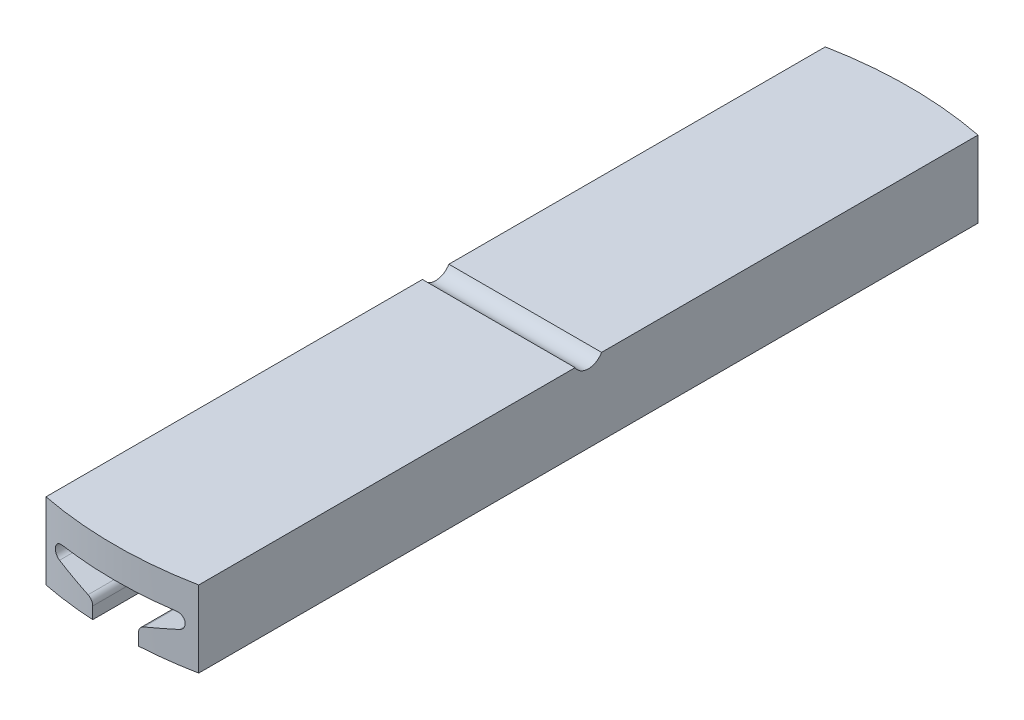
ISO-10303-21;
HEADER;
FILE_DESCRIPTION(('STEP AP214'),'2;1');
FILE_NAME('part.step','',(''),(''),'','','');
FILE_SCHEMA(('AUTOMOTIVE_DESIGN { 1 0 10303 214 1 1 1 1 }'));
ENDSEC;
DATA;
#1=APPLICATION_CONTEXT('core data for automotive mechanical design processes');
#2=APPLICATION_PROTOCOL_DEFINITION('international standard','automotive_design',2000,#1);
#3=PRODUCT_CONTEXT('',#1,'mechanical');
#4=PRODUCT('Part','Part','',(#3));
#5=PRODUCT_RELATED_PRODUCT_CATEGORY('part','',(#4));
#6=PRODUCT_DEFINITION_FORMATION('','',#4);
#7=PRODUCT_DEFINITION_CONTEXT('part definition',#1,'design');
#8=PRODUCT_DEFINITION('design','',#6,#7);
#9=PRODUCT_DEFINITION_SHAPE('','',#8);
#10=(LENGTH_UNIT() NAMED_UNIT(*) SI_UNIT(.MILLI.,.METRE.));
#11=(NAMED_UNIT(*) PLANE_ANGLE_UNIT() SI_UNIT($,.RADIAN.));
#12=(NAMED_UNIT(*) SI_UNIT($,.STERADIAN.) SOLID_ANGLE_UNIT());
#13=UNCERTAINTY_MEASURE_WITH_UNIT(LENGTH_MEASURE(1.E-05),#10,'distance_accuracy_value','');
#14=(GEOMETRIC_REPRESENTATION_CONTEXT(3) GLOBAL_UNCERTAINTY_ASSIGNED_CONTEXT((#13)) GLOBAL_UNIT_ASSIGNED_CONTEXT((#10,
#11,#12)) REPRESENTATION_CONTEXT('',''));
#15=CARTESIAN_POINT('',(0.,0.,0.));
#16=DIRECTION('',(0.,0.,1.));
#17=DIRECTION('',(1.,0.,0.));
#18=AXIS2_PLACEMENT_3D('',#15,#16,#17);
#19=CARTESIAN_POINT('',(57.,-21.,0.));
#20=DIRECTION('',(0.,-1.,0.));
#21=DIRECTION('',(0.,0.,-1.));
#22=AXIS2_PLACEMENT_3D('',#19,#20,#21);
#23=PLANE('',#22);
#24=DIRECTION('',(0.,0.,1.));
#25=VECTOR('',#24,1.);
#26=CARTESIAN_POINT('',(3.,-21.,0.));
#27=LINE('',#26,#25);
#28=CARTESIAN_POINT('',(3.,-21.,-51.9133894096696));
#29=VERTEX_POINT('',#28);
#30=CARTESIAN_POINT('',(3.,-21.,51.9133894096696));
#31=VERTEX_POINT('',#30);
#32=EDGE_CURVE('E175',#29,#31,#27,.T.);
#33=ORIENTED_EDGE('',*,*,#32,.F.);
#34=CARTESIAN_POINT('',(0.,-21.,0.));
#35=DIRECTION('',(0.,-1.,0.));
#36=DIRECTION('',(0.,0.,-1.));
#37=AXIS2_PLACEMENT_3D('',#34,#35,#36);
#38=CIRCLE('',#37,52.);
#39=CARTESIAN_POINT('',(9.99999999999997,-21.,-51.0294032886923));
#40=VERTEX_POINT('',#39);
#41=EDGE_CURVE('E61',#29,#40,#38,.T.);
#42=ORIENTED_EDGE('',*,*,#41,.T.);
#43=DIRECTION('',(0.,0.,1.));
#44=VECTOR('',#43,1.);
#45=CARTESIAN_POINT('',(9.99999999999999,-21.,-85.002));
#46=LINE('',#45,#44);
#47=CARTESIAN_POINT('',(9.99999999999997,-21.,51.0294032886923));
#48=VERTEX_POINT('',#47);
#49=EDGE_CURVE('E167',#40,#48,#46,.T.);
#50=ORIENTED_EDGE('',*,*,#49,.T.);
#51=EDGE_CURVE('E169',#48,#31,#38,.T.);
#52=ORIENTED_EDGE('',*,*,#51,.T.);
#53=EDGE_LOOP('',(#33,#42,#50,#52));
#54=FACE_BOUND('',#53,.T.);
#55=ADVANCED_FACE('F57',(#54),#23,.T.);
#56=DIRECTION('',(0.,0.,-1.));
#57=VECTOR('',#56,1.);
#58=CARTESIAN_POINT('',(-3.,-21.,0.));
#59=LINE('',#58,#57);
#60=CARTESIAN_POINT('',(-2.99999999999996,-21.,51.9133894096696));
#61=VERTEX_POINT('',#60);
#62=CARTESIAN_POINT('',(-2.99999999999996,-21.,-51.9133894096696));
#63=VERTEX_POINT('',#62);
#64=EDGE_CURVE('E188',#61,#63,#59,.T.);
#65=ORIENTED_EDGE('',*,*,#64,.F.);
#66=CARTESIAN_POINT('',(-10.,-21.,51.0294032886923));
#67=VERTEX_POINT('',#66);
#68=EDGE_CURVE('E392',#61,#67,#38,.T.);
#69=ORIENTED_EDGE('',*,*,#68,.T.);
#70=DIRECTION('',(0.,0.,1.));
#71=VECTOR('',#70,1.);
#72=CARTESIAN_POINT('',(-10.,-21.,-85.002));
#73=LINE('',#72,#71);
#74=CARTESIAN_POINT('',(-10.,-21.,-51.0294032886923));
#75=VERTEX_POINT('',#74);
#76=EDGE_CURVE('E209',#75,#67,#73,.T.);
#77=ORIENTED_EDGE('',*,*,#76,.F.);
#78=EDGE_CURVE('E168',#75,#63,#38,.T.);
#79=ORIENTED_EDGE('',*,*,#78,.T.);
#80=EDGE_LOOP('',(#65,#69,#77,#79));
#81=FACE_BOUND('',#80,.T.);
#82=ADVANCED_FACE('F332',(#81),#23,.T.);
#83=CARTESIAN_POINT('',(-7.5,-16.,-85.));
#84=DIRECTION('',(0.,0.,1.));
#85=DIRECTION('',(1.,0.,0.));
#86=AXIS2_PLACEMENT_3D('',#83,#84,#85);
#87=CYLINDRICAL_SURFACE('',#86,0.999999999999999);
#88=CARTESIAN_POINT('',(-7.85070721723684,-16.9364851561974,51.4039531183082));
#89=CARTESIAN_POINT('',(-7.90353260362164,-16.916751266977,51.3958875017139));
#90=CARTESIAN_POINT('',(-7.95467117386094,-16.8924605245184,51.3879917953355));
#91=CARTESIAN_POINT('',(-8.05220284467704,-16.8356033406847,51.3727983159302));
#92=CARTESIAN_POINT('',(-8.09859702432048,-16.803038787007,51.3655004070154));
#93=CARTESIAN_POINT('',(-8.18532370513233,-16.7304368635109,51.3517519204609));
#94=CARTESIAN_POINT('',(-8.225651945816,-16.6903942852527,51.34530193877));
#95=CARTESIAN_POINT('',(-8.2990068993382,-16.6039841013502,51.3334965061412));
#96=CARTESIAN_POINT('',(-8.33203621661436,-16.5576187614056,51.3281406648386));
#97=CARTESIAN_POINT('',(-8.3895642115429,-16.4602673719661,51.3187690748143));
#98=CARTESIAN_POINT('',(-8.41413145283524,-16.4093228919166,51.3147425668459));
#99=CARTESIAN_POINT('',(-8.4543612678185,-16.3039336907956,51.308129899944));
#100=CARTESIAN_POINT('',(-8.47002288657924,-16.2494885950572,51.3055438954731));
#101=CARTESIAN_POINT('',(-8.49181346980441,-16.139353998478,51.3019417349885));
#102=CARTESIAN_POINT('',(-8.49805457883655,-16.0836872728179,51.3009071118624));
#103=CARTESIAN_POINT('',(-8.50116748868832,-15.9720901851432,51.3003913648465));
#104=CARTESIAN_POINT('',(-8.49804032509515,-15.9161598529505,51.3009100692489));
#105=CARTESIAN_POINT('',(-8.48256167299117,-15.80596278466,51.3034716880674));
#106=CARTESIAN_POINT('',(-8.47026425508352,-15.7516882304609,51.3055056678917));
#107=CARTESIAN_POINT('',(-8.43688212541409,-15.6459890293354,51.311005680294));
#108=CARTESIAN_POINT('',(-8.41579710245438,-15.5945644834103,51.3144717635875));
#109=CARTESIAN_POINT('',(-8.365377022303,-15.4958098906054,51.3227154298492));
#110=CARTESIAN_POINT('',(-8.33601193288584,-15.4484955844895,51.3274977854678));
#111=CARTESIAN_POINT('',(-8.26992851690416,-15.3594661310073,51.3381865583419));
#112=CARTESIAN_POINT('',(-8.23321030044558,-15.317750899816,51.3440929587658));
#113=CARTESIAN_POINT('',(-8.15303903520241,-15.2406135227867,51.3568848010627));
#114=CARTESIAN_POINT('',(-8.10951771158813,-15.2052639918314,51.363780102074));
#115=CARTESIAN_POINT('',(-8.01725025426417,-15.1423456332039,51.3782626797031));
#116=CARTESIAN_POINT('',(-7.96850189759336,-15.1147801341903,51.3858502505244));
#117=CARTESIAN_POINT('',(-7.86652075834944,-15.0678762767657,51.4015617117618));
#118=CARTESIAN_POINT('',(-7.81323894818296,-15.0486466786535,51.409691183075));
#119=CARTESIAN_POINT('',(-7.70427285017815,-15.0194678266944,51.4261334483683));
#120=CARTESIAN_POINT('',(-7.64859262769653,-15.0095034692364,51.4344459213017));
#121=CARTESIAN_POINT('',(-7.57715123918404,-15.002860002719,51.4449902798717));
#122=CARTESIAN_POINT('',(-7.56172880255109,-15.0017869789128,51.4472594267135));
#123=CARTESIAN_POINT('',(-7.53087316433267,-15.0003579515914,51.451785106627));
#124=CARTESIAN_POINT('',(-7.51544001579728,-15.0000008476817,51.4540416537324));
#125=CARTESIAN_POINT('',(-7.5,-15.,51.4562921322553));
#126=B_SPLINE_CURVE_WITH_KNOTS('',3,(#88,#89,#90,#91,#92,#93,#94,#95,#96,#97,#98,#99,#100,#101,
#102,#103,#104,#105,#106,#107,#108,#109,#110,#111,#112,#113,#114,#115,#116,#117,#118,#119,#120,
#121,#122,#123,#124,#125),.UNSPECIFIED.,.F.,.F.,(4,2,2,2,2,2,2,2,2,2,2,2,2,2,2,2,2,2,4),(0.,
0.170684063890893,0.341329220564664,0.512093677790838,0.682797103262345,0.852082947782231,
1.02138694102677,1.18865913863527,1.35591284632993,1.52218809666285,1.68846923584859,
1.85536141952369,2.02225110433749,2.19093818369923,2.35969728927072,2.53059641360725,
2.70121645803805,2.74808211642799,2.79487568523367),.UNSPECIFIED.);
#127=CARTESIAN_POINT('',(-7.85070721723684,-16.9364851561974,51.4039531183081));
#128=VERTEX_POINT('',#127);
#129=CARTESIAN_POINT('',(-7.5,-15.,51.4562921322553));
#130=VERTEX_POINT('',#129);
#131=EDGE_CURVE('E357',#128,#130,#126,.T.);
#132=ORIENTED_EDGE('',*,*,#131,.F.);
#133=DIRECTION('',(0.,0.,1.));
#134=VECTOR('',#133,1.);
#135=CARTESIAN_POINT('',(-7.85070721723684,-16.9364851561974,-85.));
#136=LINE('',#135,#134);
#137=CARTESIAN_POINT('',(-7.85070721723684,-16.9364851561974,-51.4039531183082));
#138=VERTEX_POINT('',#137);
#139=EDGE_CURVE('E219',#138,#128,#136,.T.);
#140=ORIENTED_EDGE('',*,*,#139,.F.);
#141=CARTESIAN_POINT('',(-7.5,-15.,-51.4562921322553));
#142=CARTESIAN_POINT('',(-7.55679029365665,-14.999954862955,-51.4480183732125));
#143=CARTESIAN_POINT('',(-7.61355284678736,-15.004835000321,-51.4396453549943));
#144=CARTESIAN_POINT('',(-7.72542422522497,-15.024100675864,-51.4229609822562));
#145=CARTESIAN_POINT('',(-7.78053382155462,-15.0384817079258,-51.414649600392));
#146=CARTESIAN_POINT('',(-7.88758493232104,-15.0764142264997,-51.3983362270098));
#147=CARTESIAN_POINT('',(-7.93952482919636,-15.0999703507213,-51.390334394211));
#148=CARTESIAN_POINT('',(-8.03870813014423,-15.1555926976002,-51.3749129976661));
#149=CARTESIAN_POINT('',(-8.08595270197877,-15.1876567969442,-51.3674932892385));
#150=CARTESIAN_POINT('',(-8.17421942040034,-15.2592925722302,-51.3535211261875));
#151=CARTESIAN_POINT('',(-8.21526352122179,-15.298836587161,-51.3469656226725));
#152=CARTESIAN_POINT('',(-8.2901190428671,-15.3844161570371,-51.3349332028472));
#153=CARTESIAN_POINT('',(-8.32392976069881,-15.4304523422175,-51.329456391376));
#154=CARTESIAN_POINT('',(-8.38294934903987,-15.5271638037014,-51.3198504277134));
#155=CARTESIAN_POINT('',(-8.40824940783459,-15.5777820050976,-51.3157070110413));
#156=CARTESIAN_POINT('',(-8.44998129012798,-15.6826379293608,-51.3088517346127));
#157=CARTESIAN_POINT('',(-8.4664143054294,-15.7368751646985,-51.3061396824702));
#158=CARTESIAN_POINT('',(-8.48975928264279,-15.846729169997,-51.3022818882707));
#159=CARTESIAN_POINT('',(-8.49678367776645,-15.9023214144928,-51.3011176510659));
#160=CARTESIAN_POINT('',(-8.50146125084822,-16.0139098247509,-51.3003427155003));
#161=CARTESIAN_POINT('',(-8.49911462314496,-16.0699059821127,-51.3007319849226));
#162=CARTESIAN_POINT('',(-8.48516719900874,-16.1803454249546,-51.3030407088902));
#163=CARTESIAN_POINT('',(-8.47362394619863,-16.2347961929182,-51.3049506484975));
#164=CARTESIAN_POINT('',(-8.44170823452658,-16.3409664643344,-51.3102116679159));
#165=CARTESIAN_POINT('',(-8.42133633292048,-16.3926861399398,-51.3135626567694));
#166=CARTESIAN_POINT('',(-8.37229729936668,-16.4921180331151,-51.3215866314408));
#167=CARTESIAN_POINT('',(-8.34360453553917,-16.5398172709535,-51.3262637011568));
#168=CARTESIAN_POINT('',(-8.27877850556472,-16.6297438724848,-51.3367597397656));
#169=CARTESIAN_POINT('',(-8.2426421300115,-16.6719689374121,-51.3425791858132));
#170=CARTESIAN_POINT('',(-8.16352782025112,-16.7502429004688,-51.3552181993568));
#171=CARTESIAN_POINT('',(-8.12047663197522,-16.7862159542289,-51.3620484056836));
#172=CARTESIAN_POINT('',(-8.0291124597831,-16.8503795811979,-51.376409691725));
#173=CARTESIAN_POINT('',(-7.98080813348411,-16.8785826967466,-51.3839396153521));
#174=CARTESIAN_POINT('',(-7.90443643210849,-16.9150285675381,-51.3957255244387));
#175=CARTESIAN_POINT('',(-7.87778326329985,-16.926354671879,-51.3998183137172));
#176=CARTESIAN_POINT('',(-7.85070721723684,-16.9364851561974,-51.4039531183082));
#177=B_SPLINE_CURVE_WITH_KNOTS('',3,(#141,#142,#143,#144,#145,#146,#147,#148,#149,#150,#151,
#152,#153,#154,#155,#156,#157,#158,#159,#160,#161,#162,#163,#164,#165,#166,#167,#168,#169,#170,
#171,#172,#173,#174,#175,#176),.UNSPECIFIED.,.F.,.F.,(4,2,2,2,2,2,2,2,2,2,2,2,2,2,2,2,2,4),(0.,
0.171944147377924,0.343806803016595,0.515756442588236,0.687663209429171,0.858946265574074,
1.03024596068288,1.19964698682795,1.36902523842252,1.53636079972421,1.703692890797,
1.86998612465634,2.03626886377457,2.2030693682322,2.36993969177654,2.53871113311392,
2.70720852340783,2.79483602510992),.UNSPECIFIED.);
#178=CARTESIAN_POINT('',(-7.5,-15.,-51.4562921322553));
#179=VERTEX_POINT('',#178);
#180=EDGE_CURVE('E363',#179,#138,#177,.T.);
#181=ORIENTED_EDGE('',*,*,#180,.F.);
#182=DIRECTION('',(0.,0.,1.));
#183=VECTOR('',#182,1.);
#184=CARTESIAN_POINT('',(-7.5,-15.,-85.));
#185=LINE('',#184,#183);
#186=EDGE_CURVE('E251',#179,#130,#185,.T.);
#187=ORIENTED_EDGE('',*,*,#186,.T.);
#188=EDGE_LOOP('',(#132,#140,#181,#187));
#189=FACE_BOUND('',#188,.T.);
#190=ADVANCED_FACE('F315',(#189),#87,.F.);
#191=CARTESIAN_POINT('',(-7.5,-15.,-85.));
#192=DIRECTION('',(0.,1.,0.));
#193=DIRECTION('',(0.,0.,1.));
#194=AXIS2_PLACEMENT_3D('',#191,#192,#193);
#195=PLANE('',#194);
#196=CARTESIAN_POINT('',(0.,-15.,0.));
#197=DIRECTION('',(0.,1.,0.));
#198=DIRECTION('',(0.,0.,1.));
#199=AXIS2_PLACEMENT_3D('',#196,#197,#198);
#200=CIRCLE('',#199,52.);
#201=CARTESIAN_POINT('',(7.5,-15.,-51.4562921322553));
#202=VERTEX_POINT('',#201);
#203=EDGE_CURVE('E304',#202,#179,#200,.T.);
#204=ORIENTED_EDGE('',*,*,#203,.F.);
#205=DIRECTION('',(0.,0.,1.));
#206=VECTOR('',#205,1.);
#207=CARTESIAN_POINT('',(7.5,-15.,-85.));
#208=LINE('',#207,#206);
#209=CARTESIAN_POINT('',(7.5,-15.,51.4562921322553));
#210=VERTEX_POINT('',#209);
#211=EDGE_CURVE('E247',#202,#210,#208,.T.);
#212=ORIENTED_EDGE('',*,*,#211,.T.);
#213=EDGE_CURVE('E451',#130,#210,#200,.T.);
#214=ORIENTED_EDGE('',*,*,#213,.F.);
#215=ORIENTED_EDGE('',*,*,#186,.F.);
#216=EDGE_LOOP('',(#204,#212,#214,#215));
#217=FACE_BOUND('',#216,.T.);
#218=ADVANCED_FACE('F310',(#217),#195,.F.);
#219=CARTESIAN_POINT('',(7.5,-16.,-85.));
#220=DIRECTION('',(0.,0.,1.));
#221=DIRECTION('',(1.,0.,0.));
#222=AXIS2_PLACEMENT_3D('',#219,#220,#221);
#223=CYLINDRICAL_SURFACE('',#222,1.);
#224=CARTESIAN_POINT('',(7.5,-15.,51.4562921322553));
#225=CARTESIAN_POINT('',(7.55679029365665,-14.999954862955,51.4480183732125));
#226=CARTESIAN_POINT('',(7.61355284678736,-15.004835000321,51.4396453549943));
#227=CARTESIAN_POINT('',(7.72542422522497,-15.024100675864,51.4229609822562));
#228=CARTESIAN_POINT('',(7.78053382155462,-15.0384817079258,51.414649600392));
#229=CARTESIAN_POINT('',(7.88758493232104,-15.0764142264997,51.3983362270098));
#230=CARTESIAN_POINT('',(7.93952482919637,-15.0999703507213,51.390334394211));
#231=CARTESIAN_POINT('',(8.03870813014423,-15.1555926976002,51.3749129976661));
#232=CARTESIAN_POINT('',(8.08595270197878,-15.1876567969442,51.3674932892385));
#233=CARTESIAN_POINT('',(8.17421942040034,-15.2592925722302,51.3535211261875));
#234=CARTESIAN_POINT('',(8.21526352122179,-15.298836587161,51.3469656226725));
#235=CARTESIAN_POINT('',(8.2901190428671,-15.3844161570371,51.3349332028472));
#236=CARTESIAN_POINT('',(8.32392976069881,-15.4304523422175,51.329456391376));
#237=CARTESIAN_POINT('',(8.38294934903987,-15.5271638037014,51.3198504277134));
#238=CARTESIAN_POINT('',(8.40824940783459,-15.5777820050976,51.3157070110413));
#239=CARTESIAN_POINT('',(8.44998129012799,-15.6826379293608,51.3088517346127));
#240=CARTESIAN_POINT('',(8.4664143054294,-15.7368751646985,51.3061396824702));
#241=CARTESIAN_POINT('',(8.48975928264279,-15.846729169997,51.3022818882707));
#242=CARTESIAN_POINT('',(8.49678367776645,-15.9023214144928,51.3011176510659));
#243=CARTESIAN_POINT('',(8.50146125084822,-16.0139098247509,51.3003427155003));
#244=CARTESIAN_POINT('',(8.49911462314496,-16.0699059821127,51.3007319849226));
#245=CARTESIAN_POINT('',(8.48516719900874,-16.1803454249546,51.3030407088902));
#246=CARTESIAN_POINT('',(8.47362394619863,-16.2347961929182,51.3049506484975));
#247=CARTESIAN_POINT('',(8.44170823452658,-16.3409664643344,51.3102116679159));
#248=CARTESIAN_POINT('',(8.42133633292048,-16.3926861399398,51.3135626567694));
#249=CARTESIAN_POINT('',(8.37229729936668,-16.4921180331151,51.3215866314408));
#250=CARTESIAN_POINT('',(8.34360453553917,-16.5398172709535,51.3262637011568));
#251=CARTESIAN_POINT('',(8.27877850556472,-16.6297438724848,51.3367597397656));
#252=CARTESIAN_POINT('',(8.2426421300115,-16.6719689374121,51.3425791858132));
#253=CARTESIAN_POINT('',(8.16352782025111,-16.7502429004688,51.3552181993568));
#254=CARTESIAN_POINT('',(8.12047663197522,-16.7862159542289,51.3620484056836));
#255=CARTESIAN_POINT('',(8.0291124597831,-16.8503795811979,51.376409691725));
#256=CARTESIAN_POINT('',(7.98080813348411,-16.8785826967466,51.3839396153521));
#257=CARTESIAN_POINT('',(7.90443643210849,-16.9150285675381,51.3957255244387));
#258=CARTESIAN_POINT('',(7.87778326329985,-16.926354671879,51.3998183137172));
#259=CARTESIAN_POINT('',(7.85070721723684,-16.9364851561974,51.4039531183082));
#260=B_SPLINE_CURVE_WITH_KNOTS('',3,(#224,#225,#226,#227,#228,#229,#230,#231,#232,#233,#234,
#235,#236,#237,#238,#239,#240,#241,#242,#243,#244,#245,#246,#247,#248,#249,#250,#251,#252,#253,
#254,#255,#256,#257,#258,#259),.UNSPECIFIED.,.F.,.F.,(4,2,2,2,2,2,2,2,2,2,2,2,2,2,2,2,2,4),(0.,
0.171944147377927,0.343806803016597,0.51575644258824,0.687663209429174,0.858946265574076,
1.03024596068288,1.19964698682795,1.36902523842252,1.53636079972421,1.703692890797,
1.86998612465634,2.03626886377458,2.2030693682322,2.36993969177654,2.53871113311392,
2.70720852340783,2.79483602510992),.UNSPECIFIED.);
#261=CARTESIAN_POINT('',(7.85070721723684,-16.9364851561974,51.4039531183082));
#262=VERTEX_POINT('',#261);
#263=EDGE_CURVE('E273',#210,#262,#260,.T.);
#264=ORIENTED_EDGE('',*,*,#263,.F.);
#265=ORIENTED_EDGE('',*,*,#211,.F.);
#266=CARTESIAN_POINT('',(7.85070721723684,-16.9364851561974,-51.4039531183082));
#267=CARTESIAN_POINT('',(7.90353260362164,-16.916751266977,-51.3958875017139));
#268=CARTESIAN_POINT('',(7.95467117386094,-16.8924605245184,-51.3879917953355));
#269=CARTESIAN_POINT('',(8.05220284467705,-16.8356033406847,-51.3727983159302));
#270=CARTESIAN_POINT('',(8.09859702432048,-16.803038787007,-51.3655004070154));
#271=CARTESIAN_POINT('',(8.18532370513233,-16.7304368635109,-51.3517519204609));
#272=CARTESIAN_POINT('',(8.22565194581601,-16.6903942852527,-51.34530193877));
#273=CARTESIAN_POINT('',(8.2990068993382,-16.6039841013502,-51.3334965061412));
#274=CARTESIAN_POINT('',(8.33203621661436,-16.5576187614056,-51.3281406648386));
#275=CARTESIAN_POINT('',(8.3895642115429,-16.4602673719661,-51.3187690748143));
#276=CARTESIAN_POINT('',(8.41413145283525,-16.4093228919166,-51.3147425668459));
#277=CARTESIAN_POINT('',(8.4543612678185,-16.3039336907956,-51.308129899944));
#278=CARTESIAN_POINT('',(8.47002288657924,-16.2494885950572,-51.3055438954731));
#279=CARTESIAN_POINT('',(8.49181346980441,-16.139353998478,-51.3019417349885));
#280=CARTESIAN_POINT('',(8.49805457883655,-16.0836872728179,-51.3009071118624));
#281=CARTESIAN_POINT('',(8.50116748868832,-15.9720901851432,-51.3003913648465));
#282=CARTESIAN_POINT('',(8.49804032509515,-15.9161598529505,-51.3009100692489));
#283=CARTESIAN_POINT('',(8.48256167299117,-15.80596278466,-51.3034716880674));
#284=CARTESIAN_POINT('',(8.47026425508352,-15.7516882304609,-51.3055056678917));
#285=CARTESIAN_POINT('',(8.43688212541409,-15.6459890293354,-51.311005680294));
#286=CARTESIAN_POINT('',(8.41579710245438,-15.5945644834103,-51.3144717635875));
#287=CARTESIAN_POINT('',(8.365377022303,-15.4958098906054,-51.3227154298492));
#288=CARTESIAN_POINT('',(8.33601193288584,-15.4484955844895,-51.3274977854678));
#289=CARTESIAN_POINT('',(8.26992851690416,-15.3594661310073,-51.3381865583419));
#290=CARTESIAN_POINT('',(8.23321030044557,-15.317750899816,-51.3440929587658));
#291=CARTESIAN_POINT('',(8.1530390352024,-15.2406135227867,-51.3568848010627));
#292=CARTESIAN_POINT('',(8.10951771158812,-15.2052639918314,-51.363780102074));
#293=CARTESIAN_POINT('',(8.01725025426416,-15.1423456332039,-51.3782626797031));
#294=CARTESIAN_POINT('',(7.96850189759336,-15.1147801341903,-51.3858502505244));
#295=CARTESIAN_POINT('',(7.86652075834944,-15.0678762767656,-51.4015617117618));
#296=CARTESIAN_POINT('',(7.81323894818296,-15.0486466786535,-51.409691183075));
#297=CARTESIAN_POINT('',(7.70427285017815,-15.0194678266944,-51.4261334483683));
#298=CARTESIAN_POINT('',(7.64859262769653,-15.0095034692363,-51.4344459213017));
#299=CARTESIAN_POINT('',(7.57715123918404,-15.002860002719,-51.4449902798717));
#300=CARTESIAN_POINT('',(7.56172880255108,-15.0017869789128,-51.4472594267135));
#301=CARTESIAN_POINT('',(7.53087316433267,-15.0003579515914,-51.451785106627));
#302=CARTESIAN_POINT('',(7.51544001579728,-15.0000008476817,-51.4540416537324));
#303=CARTESIAN_POINT('',(7.5,-15.,-51.4562921322553));
#304=B_SPLINE_CURVE_WITH_KNOTS('',3,(#266,#267,#268,#269,#270,#271,#272,#273,#274,#275,#276,
#277,#278,#279,#280,#281,#282,#283,#284,#285,#286,#287,#288,#289,#290,#291,#292,#293,#294,#295,
#296,#297,#298,#299,#300,#301,#302,#303),.UNSPECIFIED.,.F.,.F.,(4,2,2,2,2,2,2,2,2,2,2,2,2,2,2,2,
2,2,4),(0.,0.170684063890893,0.341329220564666,0.512093677790847,0.68279710326235,
0.852082947782234,1.02138694102678,1.18865913863527,1.35591284632993,1.52218809666285,
1.6884692358486,1.8553614195237,2.02225110433749,2.19093818369924,2.35969728927072,
2.53059641360725,2.70121645803805,2.74808211642799,2.79487568523367),.UNSPECIFIED.);
#305=CARTESIAN_POINT('',(7.85070721723684,-16.9364851561974,-51.4039531183082));
#306=VERTEX_POINT('',#305);
#307=EDGE_CURVE('E298',#306,#202,#304,.T.);
#308=ORIENTED_EDGE('',*,*,#307,.F.);
#309=DIRECTION('',(0.,0.,1.));
#310=VECTOR('',#309,1.);
#311=CARTESIAN_POINT('',(7.85070721723684,-16.9364851561974,-85.));
#312=LINE('',#311,#310);
#313=EDGE_CURVE('E243',#306,#262,#312,.T.);
#314=ORIENTED_EDGE('',*,*,#313,.T.);
#315=EDGE_LOOP('',(#264,#265,#308,#314));
#316=FACE_BOUND('',#315,.T.);
#317=ADVANCED_FACE('F306',(#316),#223,.F.);
#318=CARTESIAN_POINT('',(3.64929278276316,-18.5098858182602,-85.));
#319=DIRECTION('',(0.350707217236838,-0.93648515619736,0.));
#320=DIRECTION('',(0.93648515619736,0.350707217236838,0.));
#321=AXIS2_PLACEMENT_3D('',#318,#319,#320);
#322=PLANE('',#321);
#323=CARTESIAN_POINT('',(0.,-19.8765207384784,0.));
#324=DIRECTION('',(0.350707217236838,-0.93648515619736,0.));
#325=DIRECTION('',(-0.93648515619736,-0.350707217236838,0.));
#326=AXIS2_PLACEMENT_3D('',#323,#324,#325);
#327=ELLIPSE('',#326,55.5267744030758,52.);
#328=CARTESIAN_POINT('',(3.64929278276316,-18.5098858182602,-51.8717906205837));
#329=VERTEX_POINT('',#328);
#330=EDGE_CURVE('E295',#329,#306,#327,.T.);
#331=ORIENTED_EDGE('',*,*,#330,.F.);
#332=DIRECTION('',(0.,0.,1.));
#333=VECTOR('',#332,1.);
#334=CARTESIAN_POINT('',(3.64929278276316,-18.5098858182602,-85.));
#335=LINE('',#334,#333);
#336=CARTESIAN_POINT('',(3.64929278276316,-18.5098858182602,51.8717906205836));
#337=VERTEX_POINT('',#336);
#338=EDGE_CURVE('E190',#329,#337,#335,.T.);
#339=ORIENTED_EDGE('',*,*,#338,.T.);
#340=EDGE_CURVE('E272',#262,#337,#327,.T.);
#341=ORIENTED_EDGE('',*,*,#340,.F.);
#342=ORIENTED_EDGE('',*,*,#313,.F.);
#343=EDGE_LOOP('',(#331,#339,#341,#342));
#344=FACE_BOUND('',#343,.T.);
#345=ADVANCED_FACE('F285',(#344),#322,.F.);
#346=CARTESIAN_POINT('',(4.,-19.4463709744576,-85.));
#347=DIRECTION('',(0.,0.,1.));
#348=DIRECTION('',(1.,0.,0.));
#349=AXIS2_PLACEMENT_3D('',#346,#347,#348);
#350=CYLINDRICAL_SURFACE('',#349,1.);
#351=CARTESIAN_POINT('',(3.,-19.4463709744576,-51.9133894096696));
#352=CARTESIAN_POINT('',(3.00000017424582,-19.4182749815717,-51.9133892675775));
#353=CARTESIAN_POINT('',(3.0011848276999,-19.3901924670178,-51.9133209546165));
#354=CARTESIAN_POINT('',(3.0059107447852,-19.334228530406,-51.9130475785481));
#355=CARTESIAN_POINT('',(3.00945189266584,-19.306347098539,-51.9128425221576));
#356=CARTESIAN_POINT('',(3.02357663980498,-19.2233501413061,-51.9120224915005));
#357=CARTESIAN_POINT('',(3.03766163383985,-19.1687908842787,-51.9112026572272));
#358=CARTESIAN_POINT('',(3.07477155984844,-19.0628220637971,-51.9090177261331));
#359=CARTESIAN_POINT('',(3.09779997450979,-19.0114137363976,-51.907652416891));
#360=CARTESIAN_POINT('',(3.15213860810531,-18.913193389334,-51.904380930626));
#361=CARTESIAN_POINT('',(3.18344804940353,-18.8663809386563,-51.9024748043878));
#362=CARTESIAN_POINT('',(3.25347690201982,-18.7786445366023,-51.8981321166033));
#363=CARTESIAN_POINT('',(3.2922026945099,-18.7377257097257,-51.8956950980168));
#364=CARTESIAN_POINT('',(3.37594594458009,-18.6629800611252,-51.8903145263488));
#365=CARTESIAN_POINT('',(3.42096040201716,-18.6291498767385,-51.8873712146513));
#366=CARTESIAN_POINT('',(3.49701358643409,-18.581416739339,-51.8822871289236));
#367=CARTESIAN_POINT('',(3.5264812372876,-18.5649425291185,-51.8802933849219));
#368=CARTESIAN_POINT('',(3.58686280264297,-18.5350804761537,-51.8761538198629));
#369=CARTESIAN_POINT('',(3.61777394739292,-18.5216869930254,-51.874008286286));
#370=CARTESIAN_POINT('',(3.64929278276316,-18.5098858182602,-51.8717906205837));
#371=B_SPLINE_CURVE_WITH_KNOTS('',3,(#351,#352,#353,#354,#355,#356,#357,#358,#359,#360,#361,
#362,#363,#364,#365,#366,#367,#368,#369,#370),.UNSPECIFIED.,.F.,.F.,(4,2,2,2,2,2,2,2,2,4),(0.,
0.084236159887313,0.168468182414556,0.336662496418159,0.504922373317865,0.673166455255312,
0.841555953377895,1.00986539026649,1.11116498504184,1.21227761126272),.UNSPECIFIED.);
#372=CARTESIAN_POINT('',(3.,-19.4463709744576,-51.9133894096696));
#373=VERTEX_POINT('',#372);
#374=EDGE_CURVE('E178',#373,#329,#371,.T.);
#375=ORIENTED_EDGE('',*,*,#374,.F.);
#376=DIRECTION('',(0.,0.,1.));
#377=VECTOR('',#376,1.);
#378=CARTESIAN_POINT('',(3.,-19.4463709744576,-85.));
#379=LINE('',#378,#377);
#380=CARTESIAN_POINT('',(3.,-19.4463709744576,51.9133894096696));
#381=VERTEX_POINT('',#380);
#382=EDGE_CURVE('E177',#373,#381,#379,.T.);
#383=ORIENTED_EDGE('',*,*,#382,.T.);
#384=CARTESIAN_POINT('',(3.64929278276316,-18.5098858182602,51.8717906205837));
#385=CARTESIAN_POINT('',(3.62296122344035,-18.5197470283466,51.8736431986589));
#386=CARTESIAN_POINT('',(3.59705514840773,-18.5307155804564,51.8754454842572));
#387=CARTESIAN_POINT('',(3.54625307324991,-18.5547966661626,51.8789430863032));
#388=CARTESIAN_POINT('',(3.5213570378802,-18.5679091248686,51.8806384064846));
#389=CARTESIAN_POINT('',(3.44849265276576,-18.6103151330208,51.8855496295169));
#390=CARTESIAN_POINT('',(3.40226830301686,-18.6427072476312,51.8885963747772));
#391=CARTESIAN_POINT('',(3.31590149811244,-18.7148111520696,51.8941873349078));
#392=CARTESIAN_POINT('',(3.27576182671222,-18.7545262738859,51.8967313199248));
#393=CARTESIAN_POINT('',(3.20271251992316,-18.8401557046103,51.9012906755034));
#394=CARTESIAN_POINT('',(3.16980200777749,-18.8860692606767,51.9033061101737));
#395=CARTESIAN_POINT('',(3.11219662569206,-18.9827238107068,51.9067921132712));
#396=CARTESIAN_POINT('',(3.08749181350802,-19.0334588661988,51.9082633413212));
#397=CARTESIAN_POINT('',(3.04695796439779,-19.1383653525232,51.9106584694407));
#398=CARTESIAN_POINT('',(3.03112433159986,-19.1925349877882,51.9115826529305));
#399=CARTESIAN_POINT('',(3.01331450649686,-19.2803301488569,51.9126186789543));
#400=CARTESIAN_POINT('',(3.00832230565226,-19.3133712057496,51.9129079833331));
#401=CARTESIAN_POINT('',(3.00166704460698,-19.3797270190802,51.9132930840097));
#402=CARTESIAN_POINT('',(2.99999791967792,-19.4130411652932,51.9133892328259));
#403=CARTESIAN_POINT('',(3.,-19.4463709744576,51.9133894096696));
#404=B_SPLINE_CURVE_WITH_KNOTS('',3,(#384,#385,#386,#387,#388,#389,#390,#391,#392,#393,#394,
#395,#396,#397,#398,#399,#400,#401,#402,#403),.UNSPECIFIED.,.F.,.F.,(4,2,2,2,2,2,2,2,2,4),(0.,
0.0844837437266855,0.1689645369207,0.337673361993734,0.50645914032047,0.675224436889186,
0.843784500612506,1.01225715786785,1.11235672353818,1.21227343596247),.UNSPECIFIED.);
#405=EDGE_CURVE('E206',#337,#381,#404,.T.);
#406=ORIENTED_EDGE('',*,*,#405,.F.);
#407=ORIENTED_EDGE('',*,*,#338,.F.);
#408=EDGE_LOOP('',(#375,#383,#406,#407));
#409=FACE_BOUND('',#408,.T.);
#410=ADVANCED_FACE('F280',(#409),#350,.T.);
#411=CARTESIAN_POINT('',(3.,-21.,-85.));
#412=DIRECTION('',(1.,0.,0.));
#413=DIRECTION('',(0.,0.,-1.));
#414=AXIS2_PLACEMENT_3D('',#411,#412,#413);
#415=PLANE('',#414);
#416=DIRECTION('',(0.,-1.,0.));
#417=VECTOR('',#416,1.);
#418=CARTESIAN_POINT('',(3.,120.,51.9133894096696));
#419=LINE('',#418,#417);
#420=EDGE_CURVE('E263',#381,#31,#419,.T.);
#421=ORIENTED_EDGE('',*,*,#420,.F.);
#422=ORIENTED_EDGE('',*,*,#382,.F.);
#423=DIRECTION('',(0.,-1.,0.));
#424=VECTOR('',#423,1.);
#425=CARTESIAN_POINT('',(3.,120.,-51.9133894096696));
#426=LINE('',#425,#424);
#427=EDGE_CURVE('E161',#29,#373,#426,.F.);
#428=ORIENTED_EDGE('',*,*,#427,.F.);
#429=ORIENTED_EDGE('',*,*,#32,.T.);
#430=EDGE_LOOP('',(#421,#422,#428,#429));
#431=FACE_BOUND('',#430,.T.);
#432=ADVANCED_FACE('F174',(#431),#415,.F.);
#433=CARTESIAN_POINT('',(-3.,-21.,-85.));
#434=DIRECTION('',(-1.,0.,0.));
#435=DIRECTION('',(0.,-1.,0.));
#436=AXIS2_PLACEMENT_3D('',#433,#434,#435);
#437=PLANE('',#436);
#438=DIRECTION('',(0.,-1.,0.));
#439=VECTOR('',#438,1.);
#440=CARTESIAN_POINT('',(-2.99999999999996,120.,-51.9133894096696));
#441=LINE('',#440,#439);
#442=CARTESIAN_POINT('',(-3.,-19.4463709744576,-51.9133894096696));
#443=VERTEX_POINT('',#442);
#444=EDGE_CURVE('E68',#443,#63,#441,.T.);
#445=ORIENTED_EDGE('',*,*,#444,.F.);
#446=DIRECTION('',(0.,0.,1.));
#447=VECTOR('',#446,1.);
#448=CARTESIAN_POINT('',(-3.,-19.4463709744576,-85.));
#449=LINE('',#448,#447);
#450=CARTESIAN_POINT('',(-3.,-19.4463709744576,51.9133894096696));
#451=VERTEX_POINT('',#450);
#452=EDGE_CURVE('E182',#443,#451,#449,.T.);
#453=ORIENTED_EDGE('',*,*,#452,.T.);
#454=DIRECTION('',(0.,-1.,0.));
#455=VECTOR('',#454,1.);
#456=CARTESIAN_POINT('',(-2.99999999999996,120.,51.9133894096696));
#457=LINE('',#456,#455);
#458=EDGE_CURVE('E265',#61,#451,#457,.F.);
#459=ORIENTED_EDGE('',*,*,#458,.F.);
#460=ORIENTED_EDGE('',*,*,#64,.T.);
#461=EDGE_LOOP('',(#445,#453,#459,#460));
#462=FACE_BOUND('',#461,.T.);
#463=ADVANCED_FACE('F379',(#462),#437,.F.);
#464=CARTESIAN_POINT('',(-4.,-19.4463709744576,-85.));
#465=DIRECTION('',(0.,0.,1.));
#466=DIRECTION('',(1.,0.,0.));
#467=AXIS2_PLACEMENT_3D('',#464,#465,#466);
#468=CYLINDRICAL_SURFACE('',#467,0.999999999999999);
#469=CARTESIAN_POINT('',(-3.64929278276316,-18.5098858182602,-51.8717906205837));
#470=CARTESIAN_POINT('',(-3.62296122344035,-18.5197470283466,-51.8736431986589));
#471=CARTESIAN_POINT('',(-3.59705514840773,-18.5307155804564,-51.8754454842572));
#472=CARTESIAN_POINT('',(-3.54625307324991,-18.5547966661626,-51.8789430863032));
#473=CARTESIAN_POINT('',(-3.52135703788019,-18.5679091248686,-51.8806384064846));
#474=CARTESIAN_POINT('',(-3.44849265276576,-18.6103151330208,-51.8855496295169));
#475=CARTESIAN_POINT('',(-3.40226830301686,-18.6427072476312,-51.8885963747772));
#476=CARTESIAN_POINT('',(-3.31590149811244,-18.7148111520696,-51.8941873349078));
#477=CARTESIAN_POINT('',(-3.27576182671222,-18.7545262738859,-51.8967313199248));
#478=CARTESIAN_POINT('',(-3.20271251992316,-18.8401557046103,-51.9012906755034));
#479=CARTESIAN_POINT('',(-3.16980200777749,-18.8860692606767,-51.9033061101737));
#480=CARTESIAN_POINT('',(-3.11219662569206,-18.9827238107068,-51.9067921132712));
#481=CARTESIAN_POINT('',(-3.08749181350802,-19.0334588661988,-51.9082633413212));
#482=CARTESIAN_POINT('',(-3.04695796439779,-19.1383653525232,-51.9106584694407));
#483=CARTESIAN_POINT('',(-3.03112433159985,-19.1925349877882,-51.9115826529305));
#484=CARTESIAN_POINT('',(-3.01331450649686,-19.2803301488569,-51.9126186789543));
#485=CARTESIAN_POINT('',(-3.00832230565226,-19.3133712057496,-51.9129079833331));
#486=CARTESIAN_POINT('',(-3.00166704460698,-19.3797270190802,-51.9132930840097));
#487=CARTESIAN_POINT('',(-2.99999791967792,-19.4130411652932,-51.9133892328259));
#488=CARTESIAN_POINT('',(-3.,-19.4463709744576,-51.9133894096696));
#489=B_SPLINE_CURVE_WITH_KNOTS('',3,(#469,#470,#471,#472,#473,#474,#475,#476,#477,#478,#479,
#480,#481,#482,#483,#484,#485,#486,#487,#488),.UNSPECIFIED.,.F.,.F.,(4,2,2,2,2,2,2,2,2,4),(0.,
0.0844837437266847,0.1689645369207,0.337673361993734,0.506459140320471,0.67522443688919,
0.843784500612509,1.01225715786785,1.11235672353819,1.21227343596247),.UNSPECIFIED.);
#490=CARTESIAN_POINT('',(-3.64929278276316,-18.5098858182602,-51.8717906205837));
#491=VERTEX_POINT('',#490);
#492=EDGE_CURVE('E371',#491,#443,#489,.T.);
#493=ORIENTED_EDGE('',*,*,#492,.F.);
#494=DIRECTION('',(0.,0.,1.));
#495=VECTOR('',#494,1.);
#496=CARTESIAN_POINT('',(-3.64929278276316,-18.5098858182602,-85.));
#497=LINE('',#496,#495);
#498=CARTESIAN_POINT('',(-3.64929278276316,-18.5098858182602,51.8717906205836));
#499=VERTEX_POINT('',#498);
#500=EDGE_CURVE('E198',#491,#499,#497,.T.);
#501=ORIENTED_EDGE('',*,*,#500,.T.);
#502=CARTESIAN_POINT('',(-3.,-19.4463709744576,51.9133894096696));
#503=CARTESIAN_POINT('',(-3.00000017424582,-19.4182749815717,51.9133892675775));
#504=CARTESIAN_POINT('',(-3.0011848276999,-19.3901924670178,51.9133209546165));
#505=CARTESIAN_POINT('',(-3.0059107447852,-19.3342285304061,51.9130475785481));
#506=CARTESIAN_POINT('',(-3.00945189266584,-19.306347098539,51.9128425221576));
#507=CARTESIAN_POINT('',(-3.02357663980498,-19.2233501413061,51.9120224915005));
#508=CARTESIAN_POINT('',(-3.03766163383985,-19.1687908842787,51.9112026572272));
#509=CARTESIAN_POINT('',(-3.07477155984844,-19.0628220637971,51.9090177261331));
#510=CARTESIAN_POINT('',(-3.09779997450979,-19.0114137363976,51.907652416891));
#511=CARTESIAN_POINT('',(-3.15213860810531,-18.913193389334,51.904380930626));
#512=CARTESIAN_POINT('',(-3.18344804940353,-18.8663809386563,51.9024748043878));
#513=CARTESIAN_POINT('',(-3.25347690201982,-18.7786445366023,51.8981321166033));
#514=CARTESIAN_POINT('',(-3.2922026945099,-18.7377257097257,51.8956950980168));
#515=CARTESIAN_POINT('',(-3.37594594458008,-18.6629800611252,51.8903145263488));
#516=CARTESIAN_POINT('',(-3.42096040201715,-18.6291498767385,51.8873712146512));
#517=CARTESIAN_POINT('',(-3.49701358643408,-18.581416739339,51.8822871289236));
#518=CARTESIAN_POINT('',(-3.52648123728759,-18.5649425291185,51.8802933849219));
#519=CARTESIAN_POINT('',(-3.58686280264297,-18.5350804761537,51.8761538198629));
#520=CARTESIAN_POINT('',(-3.61777394739292,-18.5216869930254,51.874008286286));
#521=CARTESIAN_POINT('',(-3.64929278276316,-18.5098858182602,51.8717906205837));
#522=B_SPLINE_CURVE_WITH_KNOTS('',3,(#502,#503,#504,#505,#506,#507,#508,#509,#510,#511,#512,
#513,#514,#515,#516,#517,#518,#519,#520,#521),.UNSPECIFIED.,.F.,.F.,(4,2,2,2,2,2,2,2,2,4),(0.,
0.0842361598873095,0.168468182414552,0.336662496418159,0.504922373317865,0.673166455255315,
0.841555953377892,1.00986539026649,1.11116498504184,1.21227761126272),.UNSPECIFIED.);
#523=EDGE_CURVE('E382',#451,#499,#522,.T.);
#524=ORIENTED_EDGE('',*,*,#523,.F.);
#525=ORIENTED_EDGE('',*,*,#452,.F.);
#526=EDGE_LOOP('',(#493,#501,#524,#525));
#527=FACE_BOUND('',#526,.T.);
#528=ADVANCED_FACE('F376',(#527),#468,.T.);
#529=CARTESIAN_POINT('',(-7.85070721723684,-16.9364851561974,-85.));
#530=DIRECTION('',(-0.350707217236838,-0.93648515619736,0.));
#531=DIRECTION('',(0.93648515619736,-0.350707217236838,0.));
#532=AXIS2_PLACEMENT_3D('',#529,#530,#531);
#533=PLANE('',#532);
#534=CARTESIAN_POINT('',(0.,-19.8765207384785,0.));
#535=DIRECTION('',(-0.350707217236838,-0.93648515619736,0.));
#536=DIRECTION('',(0.93648515619736,-0.350707217236838,0.));
#537=AXIS2_PLACEMENT_3D('',#534,#535,#536);
#538=ELLIPSE('',#537,55.5267744030758,52.);
#539=EDGE_CURVE('E387',#499,#128,#538,.T.);
#540=ORIENTED_EDGE('',*,*,#539,.F.);
#541=ORIENTED_EDGE('',*,*,#500,.F.);
#542=EDGE_CURVE('E369',#138,#491,#538,.T.);
#543=ORIENTED_EDGE('',*,*,#542,.F.);
#544=ORIENTED_EDGE('',*,*,#139,.T.);
#545=EDGE_LOOP('',(#540,#541,#543,#544));
#546=FACE_BOUND('',#545,.T.);
#547=ADVANCED_FACE('F354',(#546),#533,.F.);
#548=CARTESIAN_POINT('',(-10.,-11.,-85.002));
#549=DIRECTION('',(0.,1.,0.));
#550=DIRECTION('',(0.,0.,1.));
#551=AXIS2_PLACEMENT_3D('',#548,#549,#550);
#552=PLANE('',#551);
#553=DIRECTION('',(0.,0.,1.));
#554=VECTOR('',#553,1.);
#555=CARTESIAN_POINT('',(-10.,-11.,-85.002));
#556=LINE('',#555,#554);
#557=CARTESIAN_POINT('',(-10.,-11.,-51.0294032886923));
#558=VERTEX_POINT('',#557);
#559=CARTESIAN_POINT('',(-10.,-11.,-1.73205080756888));
#560=VERTEX_POINT('',#559);
#561=EDGE_CURVE('E214',#558,#560,#556,.T.);
#562=ORIENTED_EDGE('',*,*,#561,.T.);
#563=DIRECTION('',(1.,0.,0.));
#564=VECTOR('',#563,1.);
#565=CARTESIAN_POINT('',(57.,-11.,-1.73205080756887));
#566=LINE('',#565,#564);
#567=CARTESIAN_POINT('',(9.99999999999999,-11.,-1.73205080756887));
#568=VERTEX_POINT('',#567);
#569=EDGE_CURVE('E258',#568,#560,#566,.F.);
#570=ORIENTED_EDGE('',*,*,#569,.F.);
#571=DIRECTION('',(0.,0.,1.));
#572=VECTOR('',#571,1.);
#573=CARTESIAN_POINT('',(9.99999999999999,-11.,-85.002));
#574=LINE('',#573,#572);
#575=CARTESIAN_POINT('',(9.99999999999997,-11.,-51.0294032886923));
#576=VERTEX_POINT('',#575);
#577=EDGE_CURVE('E213',#576,#568,#574,.T.);
#578=ORIENTED_EDGE('',*,*,#577,.F.);
#579=CARTESIAN_POINT('',(0.,-11.,0.));
#580=DIRECTION('',(0.,1.,0.));
#581=DIRECTION('',(0.,0.,1.));
#582=AXIS2_PLACEMENT_3D('',#579,#580,#581);
#583=CIRCLE('',#582,52.);
#584=EDGE_CURVE('E76',#558,#576,#583,.F.);
#585=ORIENTED_EDGE('',*,*,#584,.F.);
#586=EDGE_LOOP('',(#562,#570,#578,#585));
#587=FACE_BOUND('',#586,.T.);
#588=ADVANCED_FACE('F343',(#587),#552,.T.);
#589=DIRECTION('',(1.,0.,0.));
#590=VECTOR('',#589,1.);
#591=CARTESIAN_POINT('',(57.,-11.,1.73205080756887));
#592=LINE('',#591,#590);
#593=CARTESIAN_POINT('',(-10.,-11.,1.73205080756886));
#594=VERTEX_POINT('',#593);
#595=CARTESIAN_POINT('',(9.99999999999999,-11.,1.73205080756888));
#596=VERTEX_POINT('',#595);
#597=EDGE_CURVE('E202',#594,#596,#592,.T.);
#598=ORIENTED_EDGE('',*,*,#597,.F.);
#599=CARTESIAN_POINT('',(-10.,-11.,51.0294032886923));
#600=VERTEX_POINT('',#599);
#601=EDGE_CURVE('E218',#594,#600,#556,.T.);
#602=ORIENTED_EDGE('',*,*,#601,.T.);
#603=CARTESIAN_POINT('',(0.,-11.,0.));
#604=DIRECTION('',(0.,-1.,0.));
#605=DIRECTION('',(0.,0.,-1.));
#606=AXIS2_PLACEMENT_3D('',#603,#604,#605);
#607=CIRCLE('',#606,52.);
#608=CARTESIAN_POINT('',(9.99999999999999,-11.,51.0294032886923));
#609=VERTEX_POINT('',#608);
#610=EDGE_CURVE('E228',#600,#609,#607,.F.);
#611=ORIENTED_EDGE('',*,*,#610,.T.);
#612=EDGE_CURVE('E224',#596,#609,#574,.T.);
#613=ORIENTED_EDGE('',*,*,#612,.F.);
#614=EDGE_LOOP('',(#598,#602,#611,#613));
#615=FACE_BOUND('',#614,.T.);
#616=ADVANCED_FACE('F321',(#615),#552,.T.);
#617=CARTESIAN_POINT('',(9.99999999999999,-11.,-85.002));
#618=DIRECTION('',(1.,0.,0.));
#619=DIRECTION('',(0.,1.,0.));
#620=AXIS2_PLACEMENT_3D('',#617,#618,#619);
#621=PLANE('',#620);
#622=CARTESIAN_POINT('',(9.99999999999999,-10.,0.));
#623=DIRECTION('',(1.,0.,0.));
#624=DIRECTION('',(0.,1.,0.));
#625=AXIS2_PLACEMENT_3D('',#622,#623,#624);
#626=CIRCLE('',#625,2.);
#627=EDGE_CURVE('E194',#596,#568,#626,.T.);
#628=ORIENTED_EDGE('',*,*,#627,.F.);
#629=ORIENTED_EDGE('',*,*,#612,.T.);
#630=DIRECTION('',(0.,-1.,0.));
#631=VECTOR('',#630,1.);
#632=CARTESIAN_POINT('',(9.99999999999999,0.,51.0294032886923));
#633=LINE('',#632,#631);
#634=EDGE_CURVE('E223',#609,#48,#633,.T.);
#635=ORIENTED_EDGE('',*,*,#634,.T.);
#636=ORIENTED_EDGE('',*,*,#49,.F.);
#637=DIRECTION('',(0.,-1.,0.));
#638=VECTOR('',#637,1.);
#639=CARTESIAN_POINT('',(9.99999999999999,0.,-51.0294032886923));
#640=LINE('',#639,#638);
#641=EDGE_CURVE('E157',#576,#40,#640,.T.);
#642=ORIENTED_EDGE('',*,*,#641,.F.);
#643=ORIENTED_EDGE('',*,*,#577,.T.);
#644=EDGE_LOOP('',(#628,#629,#635,#636,#642,#643));
#645=FACE_BOUND('',#644,.T.);
#646=ADVANCED_FACE('F341',(#645),#621,.T.);
#647=CARTESIAN_POINT('',(-10.,-11.,-85.002));
#648=DIRECTION('',(-1.,0.,0.));
#649=DIRECTION('',(0.,0.,1.));
#650=AXIS2_PLACEMENT_3D('',#647,#648,#649);
#651=PLANE('',#650);
#652=CARTESIAN_POINT('',(-10.,-10.,0.));
#653=DIRECTION('',(-1.,0.,0.));
#654=DIRECTION('',(0.,0.,1.));
#655=AXIS2_PLACEMENT_3D('',#652,#653,#654);
#656=CIRCLE('',#655,2.);
#657=EDGE_CURVE('E262',#560,#594,#656,.T.);
#658=ORIENTED_EDGE('',*,*,#657,.F.);
#659=ORIENTED_EDGE('',*,*,#561,.F.);
#660=DIRECTION('',(0.,-1.,0.));
#661=VECTOR('',#660,1.);
#662=CARTESIAN_POINT('',(-10.,0.,-51.0294032886923));
#663=LINE('',#662,#661);
#664=EDGE_CURVE('E11',#75,#558,#663,.F.);
#665=ORIENTED_EDGE('',*,*,#664,.F.);
#666=ORIENTED_EDGE('',*,*,#76,.T.);
#667=DIRECTION('',(0.,-1.,0.));
#668=VECTOR('',#667,1.);
#669=CARTESIAN_POINT('',(-10.,0.,51.0294032886923));
#670=LINE('',#669,#668);
#671=EDGE_CURVE('E203',#67,#600,#670,.F.);
#672=ORIENTED_EDGE('',*,*,#671,.T.);
#673=ORIENTED_EDGE('',*,*,#601,.F.);
#674=EDGE_LOOP('',(#658,#659,#665,#666,#672,#673));
#675=FACE_BOUND('',#674,.T.);
#676=ADVANCED_FACE('F320',(#675),#651,.T.);
#677=CARTESIAN_POINT('',(0.,0.,0.));
#678=DIRECTION('',(0.,-1.,0.));
#679=DIRECTION('',(0.,0.,-1.));
#680=AXIS2_PLACEMENT_3D('',#677,#678,#679);
#681=CYLINDRICAL_SURFACE('',#680,52.);
#682=ORIENTED_EDGE('',*,*,#584,.T.);
#683=ORIENTED_EDGE('',*,*,#641,.T.);
#684=ORIENTED_EDGE('',*,*,#41,.F.);
#685=ORIENTED_EDGE('',*,*,#427,.T.);
#686=ORIENTED_EDGE('',*,*,#374,.T.);
#687=ORIENTED_EDGE('',*,*,#330,.T.);
#688=ORIENTED_EDGE('',*,*,#307,.T.);
#689=ORIENTED_EDGE('',*,*,#203,.T.);
#690=ORIENTED_EDGE('',*,*,#180,.T.);
#691=ORIENTED_EDGE('',*,*,#542,.T.);
#692=ORIENTED_EDGE('',*,*,#492,.T.);
#693=ORIENTED_EDGE('',*,*,#444,.T.);
#694=ORIENTED_EDGE('',*,*,#78,.F.);
#695=ORIENTED_EDGE('',*,*,#664,.T.);
#696=EDGE_LOOP('',(#682,#683,#684,#685,#686,#687,#688,#689,#690,#691,#692,#693,#694,#695));
#697=FACE_BOUND('',#696,.T.);
#698=ADVANCED_FACE('F160',(#697),#681,.T.);
#699=CARTESIAN_POINT('',(57.,-10.,0.));
#700=DIRECTION('',(1.,0.,0.));
#701=DIRECTION('',(0.,0.,-1.));
#702=AXIS2_PLACEMENT_3D('',#699,#700,#701);
#703=CYLINDRICAL_SURFACE('',#702,2.);
#704=ORIENTED_EDGE('',*,*,#597,.T.);
#705=ORIENTED_EDGE('',*,*,#627,.T.);
#706=ORIENTED_EDGE('',*,*,#569,.T.);
#707=ORIENTED_EDGE('',*,*,#657,.T.);
#708=EDGE_LOOP('',(#704,#705,#706,#707));
#709=FACE_BOUND('',#708,.T.);
#710=ADVANCED_FACE('F319',(#709),#703,.F.);
#711=CARTESIAN_POINT('',(0.,0.,0.));
#712=DIRECTION('',(0.,-1.,0.));
#713=DIRECTION('',(0.,0.,-1.));
#714=AXIS2_PLACEMENT_3D('',#711,#712,#713);
#715=CYLINDRICAL_SURFACE('',#714,52.);
#716=ORIENTED_EDGE('',*,*,#634,.F.);
#717=ORIENTED_EDGE('',*,*,#610,.F.);
#718=ORIENTED_EDGE('',*,*,#671,.F.);
#719=ORIENTED_EDGE('',*,*,#68,.F.);
#720=ORIENTED_EDGE('',*,*,#458,.T.);
#721=ORIENTED_EDGE('',*,*,#523,.T.);
#722=ORIENTED_EDGE('',*,*,#539,.T.);
#723=ORIENTED_EDGE('',*,*,#131,.T.);
#724=ORIENTED_EDGE('',*,*,#213,.T.);
#725=ORIENTED_EDGE('',*,*,#263,.T.);
#726=ORIENTED_EDGE('',*,*,#340,.T.);
#727=ORIENTED_EDGE('',*,*,#405,.T.);
#728=ORIENTED_EDGE('',*,*,#420,.T.);
#729=ORIENTED_EDGE('',*,*,#51,.F.);
#730=EDGE_LOOP('',(#716,#717,#718,#719,#720,#721,#722,#723,#724,#725,#726,#727,#728,#729));
#731=FACE_BOUND('',#730,.T.);
#732=ADVANCED_FACE('F323',(#731),#715,.T.);
#733=CLOSED_SHELL('',(#55,#82,#190,#218,#317,#345,#410,#432,#463,#528,#547,#588,#616,#646,#676,
#698,#710,#732));
#734=MANIFOLD_SOLID_BREP('B2',#733);
#735=ADVANCED_BREP_SHAPE_REPRESENTATION('',(#18,#734),#14);
#736=SHAPE_DEFINITION_REPRESENTATION(#9,#735);
ENDSEC;
END-ISO-10303-21;
